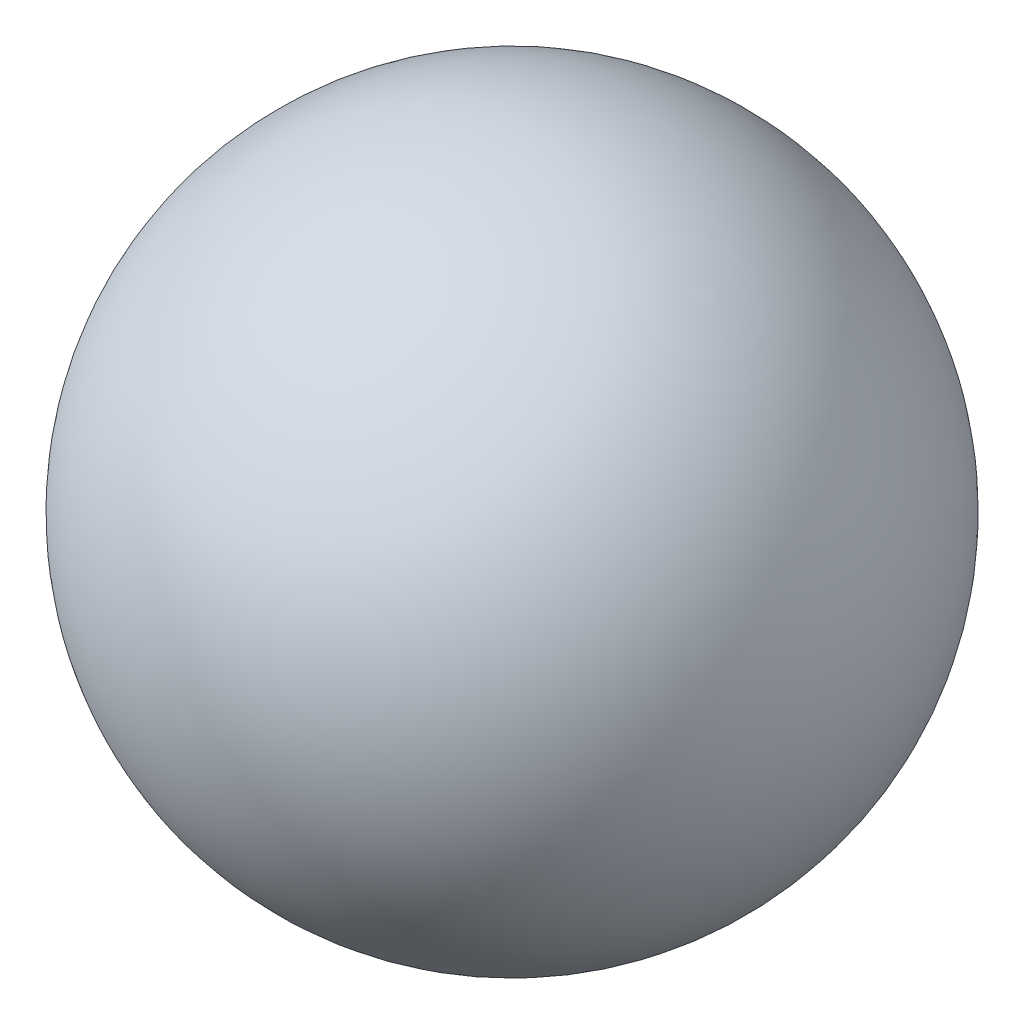
ISO-10303-21;
HEADER;
FILE_DESCRIPTION(('STEP AP214'),'2;1');
FILE_NAME('part.step','',(''),(''),'','','');
FILE_SCHEMA(('AUTOMOTIVE_DESIGN { 1 0 10303 214 1 1 1 1 }'));
ENDSEC;
DATA;
#1=APPLICATION_CONTEXT('core data for automotive mechanical design processes');
#2=APPLICATION_PROTOCOL_DEFINITION('international standard','automotive_design',2000,#1);
#3=PRODUCT_CONTEXT('',#1,'mechanical');
#4=PRODUCT('Part','Part','',(#3));
#5=PRODUCT_RELATED_PRODUCT_CATEGORY('part','',(#4));
#6=PRODUCT_DEFINITION_FORMATION('','',#4);
#7=PRODUCT_DEFINITION_CONTEXT('part definition',#1,'design');
#8=PRODUCT_DEFINITION('design','',#6,#7);
#9=PRODUCT_DEFINITION_SHAPE('','',#8);
#10=(LENGTH_UNIT() NAMED_UNIT(*) SI_UNIT(.MILLI.,.METRE.));
#11=(NAMED_UNIT(*) PLANE_ANGLE_UNIT() SI_UNIT($,.RADIAN.));
#12=(NAMED_UNIT(*) SI_UNIT($,.STERADIAN.) SOLID_ANGLE_UNIT());
#13=UNCERTAINTY_MEASURE_WITH_UNIT(LENGTH_MEASURE(1.E-05),#10,'distance_accuracy_value','');
#14=(GEOMETRIC_REPRESENTATION_CONTEXT(3) GLOBAL_UNCERTAINTY_ASSIGNED_CONTEXT((#13)) GLOBAL_UNIT_ASSIGNED_CONTEXT((#10,
#11,#12)) REPRESENTATION_CONTEXT('',''));
#15=CARTESIAN_POINT('',(0.,0.,0.));
#16=DIRECTION('',(0.,0.,1.));
#17=DIRECTION('',(1.,0.,0.));
#18=AXIS2_PLACEMENT_3D('',#15,#16,#17);
#19=CARTESIAN_POINT('',(0.,0.,0.));
#20=DIRECTION('',(0.,0.,1.));
#21=DIRECTION('',(-1.,0.,0.));
#22=AXIS2_PLACEMENT_3D('',#19,#20,#21);
#23=SPHERICAL_SURFACE('',#22,11.43);
#24=CARTESIAN_POINT('',(0.,0.,11.43));
#25=VERTEX_POINT('',#24);
#26=VERTEX_LOOP('',#25);
#27=FACE_BOUND('',#26,.T.);
#28=ADVANCED_FACE('F29',(#27),#23,.T.);
#29=CLOSED_SHELL('',(#28));
#30=MANIFOLD_SOLID_BREP('B2',#29);
#31=ADVANCED_BREP_SHAPE_REPRESENTATION('',(#18,#30),#14);
#32=SHAPE_DEFINITION_REPRESENTATION(#9,#31);
ENDSEC;
END-ISO-10303-21;
